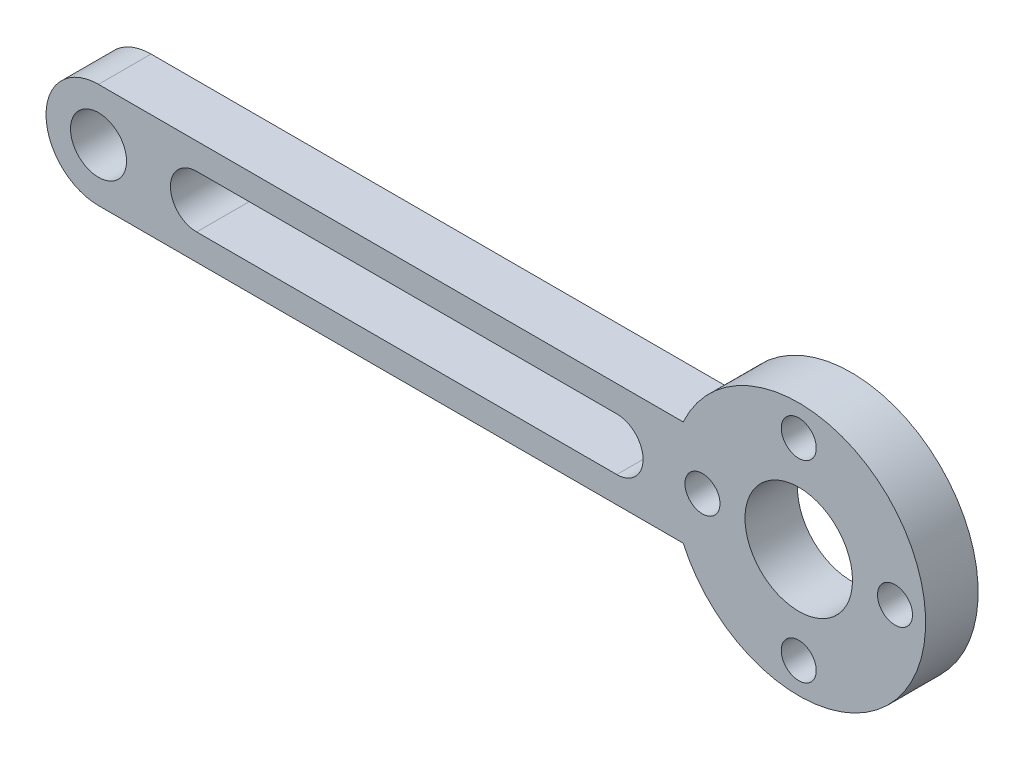
ISO-10303-21;
HEADER;
FILE_DESCRIPTION(('STEP AP214'),'2;1');
FILE_NAME('part.step','',(''),(''),'','','');
FILE_SCHEMA(('AUTOMOTIVE_DESIGN { 1 0 10303 214 1 1 1 1 }'));
ENDSEC;
DATA;
#1=APPLICATION_CONTEXT('core data for automotive mechanical design processes');
#2=APPLICATION_PROTOCOL_DEFINITION('international standard','automotive_design',2000,#1);
#3=PRODUCT_CONTEXT('',#1,'mechanical');
#4=PRODUCT('Part','Part','',(#3));
#5=PRODUCT_RELATED_PRODUCT_CATEGORY('part','',(#4));
#6=PRODUCT_DEFINITION_FORMATION('','',#4);
#7=PRODUCT_DEFINITION_CONTEXT('part definition',#1,'design');
#8=PRODUCT_DEFINITION('design','',#6,#7);
#9=PRODUCT_DEFINITION_SHAPE('','',#8);
#10=(LENGTH_UNIT() NAMED_UNIT(*) SI_UNIT(.MILLI.,.METRE.));
#11=(NAMED_UNIT(*) PLANE_ANGLE_UNIT() SI_UNIT($,.RADIAN.));
#12=(NAMED_UNIT(*) SI_UNIT($,.STERADIAN.) SOLID_ANGLE_UNIT());
#13=UNCERTAINTY_MEASURE_WITH_UNIT(LENGTH_MEASURE(1.E-05),#10,'distance_accuracy_value','');
#14=(GEOMETRIC_REPRESENTATION_CONTEXT(3) GLOBAL_UNCERTAINTY_ASSIGNED_CONTEXT((#13)) GLOBAL_UNIT_ASSIGNED_CONTEXT((#10,
#11,#12)) REPRESENTATION_CONTEXT('',''));
#15=CARTESIAN_POINT('',(0.,0.,0.));
#16=DIRECTION('',(0.,0.,1.));
#17=DIRECTION('',(1.,0.,0.));
#18=AXIS2_PLACEMENT_3D('',#15,#16,#17);
#19=CARTESIAN_POINT('',(0.,-8.,3.));
#20=DIRECTION('',(0.,1.,0.));
#21=DIRECTION('',(0.,0.,1.));
#22=AXIS2_PLACEMENT_3D('',#19,#20,#21);
#23=PLANE('',#22);
#24=DIRECTION('',(1.,0.,0.));
#25=VECTOR('',#24,1.);
#26=CARTESIAN_POINT('',(0.,-8.,0.));
#27=LINE('',#26,#25);
#28=CARTESIAN_POINT('',(12.,-8.,0.));
#29=VERTEX_POINT('',#28);
#30=CARTESIAN_POINT('',(45.399810608778,-8.,0.));
#31=VERTEX_POINT('',#30);
#32=EDGE_CURVE('E161',#29,#31,#27,.T.);
#33=ORIENTED_EDGE('',*,*,#32,.T.);
#34=DIRECTION('',(0.,0.,-1.));
#35=VECTOR('',#34,1.);
#36=CARTESIAN_POINT('',(45.399810608778,-8.,3.));
#37=LINE('',#36,#35);
#38=CARTESIAN_POINT('',(45.399810608778,-8.,3.));
#39=VERTEX_POINT('',#38);
#40=EDGE_CURVE('E11',#39,#31,#37,.T.);
#41=ORIENTED_EDGE('',*,*,#40,.F.);
#42=DIRECTION('',(1.,0.,0.));
#43=VECTOR('',#42,1.);
#44=CARTESIAN_POINT('',(0.,-8.,3.));
#45=LINE('',#44,#43);
#46=CARTESIAN_POINT('',(12.,-8.,3.));
#47=VERTEX_POINT('',#46);
#48=EDGE_CURVE('E114',#47,#39,#45,.T.);
#49=ORIENTED_EDGE('',*,*,#48,.F.);
#50=DIRECTION('',(0.,0.,-1.));
#51=VECTOR('',#50,1.);
#52=CARTESIAN_POINT('',(12.,-8.,3.));
#53=LINE('',#52,#51);
#54=EDGE_CURVE('E169',#47,#29,#53,.T.);
#55=ORIENTED_EDGE('',*,*,#54,.T.);
#56=EDGE_LOOP('',(#33,#41,#49,#55));
#57=FACE_BOUND('',#56,.T.);
#58=ADVANCED_FACE('F37',(#57),#23,.F.);
#59=CARTESIAN_POINT('',(52.,-5.,3.));
#60=DIRECTION('',(0.,0.,-1.));
#61=DIRECTION('',(-1.,0.,0.));
#62=AXIS2_PLACEMENT_3D('',#59,#60,#61);
#63=CYLINDRICAL_SURFACE('',#62,7.25);
#64=CARTESIAN_POINT('',(52.,-5.,0.));
#65=DIRECTION('',(0.,0.,1.));
#66=DIRECTION('',(1.,0.,0.));
#67=AXIS2_PLACEMENT_3D('',#64,#65,#66);
#68=CIRCLE('',#67,7.25);
#69=CARTESIAN_POINT('',(45.399810608778,-2.,0.));
#70=VERTEX_POINT('',#69);
#71=EDGE_CURVE('E120',#31,#70,#68,.T.);
#72=ORIENTED_EDGE('',*,*,#71,.T.);
#73=DIRECTION('',(0.,0.,-1.));
#74=VECTOR('',#73,1.);
#75=CARTESIAN_POINT('',(45.399810608778,-2.,3.));
#76=LINE('',#75,#74);
#77=CARTESIAN_POINT('',(45.399810608778,-2.,3.));
#78=VERTEX_POINT('',#77);
#79=EDGE_CURVE('E47',#78,#70,#76,.T.);
#80=ORIENTED_EDGE('',*,*,#79,.F.);
#81=CARTESIAN_POINT('',(52.,-5.,3.));
#82=DIRECTION('',(0.,0.,1.));
#83=DIRECTION('',(1.,0.,0.));
#84=AXIS2_PLACEMENT_3D('',#81,#82,#83);
#85=CIRCLE('',#84,7.25);
#86=EDGE_CURVE('E108',#39,#78,#85,.T.);
#87=ORIENTED_EDGE('',*,*,#86,.F.);
#88=ORIENTED_EDGE('',*,*,#40,.T.);
#89=EDGE_LOOP('',(#72,#80,#87,#88));
#90=FACE_BOUND('',#89,.T.);
#91=ADVANCED_FACE('F119',(#90),#63,.T.);
#92=CARTESIAN_POINT('',(0.,-2.,3.));
#93=DIRECTION('',(0.,1.,0.));
#94=DIRECTION('',(0.,0.,1.));
#95=AXIS2_PLACEMENT_3D('',#92,#93,#94);
#96=PLANE('',#95);
#97=DIRECTION('',(1.,0.,0.));
#98=VECTOR('',#97,1.);
#99=CARTESIAN_POINT('',(0.,-2.,0.));
#100=LINE('',#99,#98);
#101=CARTESIAN_POINT('',(12.,-2.,0.));
#102=VERTEX_POINT('',#101);
#103=EDGE_CURVE('E165',#102,#70,#100,.T.);
#104=ORIENTED_EDGE('',*,*,#103,.F.);
#105=DIRECTION('',(0.,0.,-1.));
#106=VECTOR('',#105,1.);
#107=CARTESIAN_POINT('',(12.,-2.,3.));
#108=LINE('',#107,#106);
#109=CARTESIAN_POINT('',(12.,-2.,3.));
#110=VERTEX_POINT('',#109);
#111=EDGE_CURVE('E84',#110,#102,#108,.T.);
#112=ORIENTED_EDGE('',*,*,#111,.F.);
#113=DIRECTION('',(1.,0.,0.));
#114=VECTOR('',#113,1.);
#115=CARTESIAN_POINT('',(0.,-2.,3.));
#116=LINE('',#115,#114);
#117=EDGE_CURVE('E112',#110,#78,#116,.T.);
#118=ORIENTED_EDGE('',*,*,#117,.T.);
#119=ORIENTED_EDGE('',*,*,#79,.T.);
#120=EDGE_LOOP('',(#104,#112,#118,#119));
#121=FACE_BOUND('',#120,.T.);
#122=ADVANCED_FACE('F125',(#121),#96,.T.);
#123=CARTESIAN_POINT('',(41.607192877574,-5.,3.));
#124=DIRECTION('',(0.,0.,-1.));
#125=DIRECTION('',(-1.,0.,0.));
#126=AXIS2_PLACEMENT_3D('',#123,#124,#125);
#127=CYLINDRICAL_SURFACE('',#126,1.5);
#128=CARTESIAN_POINT('',(41.607192877574,-5.,0.));
#129=DIRECTION('',(0.,0.,1.));
#130=DIRECTION('',(1.,0.,0.));
#131=AXIS2_PLACEMENT_3D('',#128,#129,#130);
#132=CIRCLE('',#131,1.5);
#133=CARTESIAN_POINT('',(41.607192877574,-6.5,0.));
#134=VERTEX_POINT('',#133);
#135=CARTESIAN_POINT('',(41.607192877574,-3.5,0.));
#136=VERTEX_POINT('',#135);
#137=EDGE_CURVE('E137',#134,#136,#132,.T.);
#138=ORIENTED_EDGE('',*,*,#137,.F.);
#139=DIRECTION('',(0.,0.,-1.));
#140=VECTOR('',#139,1.);
#141=CARTESIAN_POINT('',(41.607192877574,-6.5,3.));
#142=LINE('',#141,#140);
#143=CARTESIAN_POINT('',(41.607192877574,-6.5,3.));
#144=VERTEX_POINT('',#143);
#145=EDGE_CURVE('E41',#144,#134,#142,.T.);
#146=ORIENTED_EDGE('',*,*,#145,.F.);
#147=CARTESIAN_POINT('',(41.607192877574,-5.,3.));
#148=DIRECTION('',(0.,0.,1.));
#149=DIRECTION('',(1.,0.,0.));
#150=AXIS2_PLACEMENT_3D('',#147,#148,#149);
#151=CIRCLE('',#150,1.5);
#152=CARTESIAN_POINT('',(41.607192877574,-3.5,3.));
#153=VERTEX_POINT('',#152);
#154=EDGE_CURVE('E202',#144,#153,#151,.T.);
#155=ORIENTED_EDGE('',*,*,#154,.T.);
#156=DIRECTION('',(0.,0.,-1.));
#157=VECTOR('',#156,1.);
#158=CARTESIAN_POINT('',(41.607192877574,-3.5,3.));
#159=LINE('',#158,#157);
#160=EDGE_CURVE('E127',#153,#136,#159,.T.);
#161=ORIENTED_EDGE('',*,*,#160,.T.);
#162=EDGE_LOOP('',(#138,#146,#155,#161));
#163=FACE_BOUND('',#162,.T.);
#164=ADVANCED_FACE('F184',(#163),#127,.F.);
#165=CARTESIAN_POINT('',(0.,-6.5,3.));
#166=DIRECTION('',(0.,1.,0.));
#167=DIRECTION('',(0.,0.,1.));
#168=AXIS2_PLACEMENT_3D('',#165,#166,#167);
#169=PLANE('',#168);
#170=DIRECTION('',(1.,0.,0.));
#171=VECTOR('',#170,1.);
#172=CARTESIAN_POINT('',(0.,-6.5,0.));
#173=LINE('',#172,#171);
#174=CARTESIAN_POINT('',(17.607192877574,-6.5,0.));
#175=VERTEX_POINT('',#174);
#176=EDGE_CURVE('E140',#175,#134,#173,.T.);
#177=ORIENTED_EDGE('',*,*,#176,.F.);
#178=DIRECTION('',(0.,0.,-1.));
#179=VECTOR('',#178,1.);
#180=CARTESIAN_POINT('',(17.607192877574,-6.5,3.));
#181=LINE('',#180,#179);
#182=CARTESIAN_POINT('',(17.607192877574,-6.5,3.));
#183=VERTEX_POINT('',#182);
#184=EDGE_CURVE('E174',#183,#175,#181,.T.);
#185=ORIENTED_EDGE('',*,*,#184,.F.);
#186=DIRECTION('',(1.,0.,0.));
#187=VECTOR('',#186,1.);
#188=CARTESIAN_POINT('',(0.,-6.5,3.));
#189=LINE('',#188,#187);
#190=EDGE_CURVE('E183',#183,#144,#189,.T.);
#191=ORIENTED_EDGE('',*,*,#190,.T.);
#192=ORIENTED_EDGE('',*,*,#145,.T.);
#193=EDGE_LOOP('',(#177,#185,#191,#192));
#194=FACE_BOUND('',#193,.T.);
#195=ADVANCED_FACE('F181',(#194),#169,.T.);
#196=CARTESIAN_POINT('',(17.607192877574,-5.,3.));
#197=DIRECTION('',(0.,0.,-1.));
#198=DIRECTION('',(-1.,0.,0.));
#199=AXIS2_PLACEMENT_3D('',#196,#197,#198);
#200=CYLINDRICAL_SURFACE('',#199,1.5);
#201=CARTESIAN_POINT('',(17.607192877574,-5.,0.));
#202=DIRECTION('',(0.,0.,1.));
#203=DIRECTION('',(1.,0.,0.));
#204=AXIS2_PLACEMENT_3D('',#201,#202,#203);
#205=CIRCLE('',#204,1.5);
#206=CARTESIAN_POINT('',(17.607192877574,-3.5,0.));
#207=VERTEX_POINT('',#206);
#208=EDGE_CURVE('E143',#207,#175,#205,.T.);
#209=ORIENTED_EDGE('',*,*,#208,.F.);
#210=DIRECTION('',(0.,0.,-1.));
#211=VECTOR('',#210,1.);
#212=CARTESIAN_POINT('',(17.607192877574,-3.5,3.));
#213=LINE('',#212,#211);
#214=CARTESIAN_POINT('',(17.607192877574,-3.5,3.));
#215=VERTEX_POINT('',#214);
#216=EDGE_CURVE('E173',#215,#207,#213,.T.);
#217=ORIENTED_EDGE('',*,*,#216,.F.);
#218=CARTESIAN_POINT('',(17.607192877574,-5.,3.));
#219=DIRECTION('',(0.,0.,1.));
#220=DIRECTION('',(1.,0.,0.));
#221=AXIS2_PLACEMENT_3D('',#218,#219,#220);
#222=CIRCLE('',#221,1.5);
#223=EDGE_CURVE('E193',#215,#183,#222,.T.);
#224=ORIENTED_EDGE('',*,*,#223,.T.);
#225=ORIENTED_EDGE('',*,*,#184,.T.);
#226=EDGE_LOOP('',(#209,#217,#224,#225));
#227=FACE_BOUND('',#226,.T.);
#228=ADVANCED_FACE('F190',(#227),#200,.F.);
#229=CARTESIAN_POINT('',(46.5,-5.,3.));
#230=DIRECTION('',(0.,0.,-1.));
#231=DIRECTION('',(-1.,0.,0.));
#232=AXIS2_PLACEMENT_3D('',#229,#230,#231);
#233=CYLINDRICAL_SURFACE('',#232,0.999999999999998);
#234=CARTESIAN_POINT('',(46.5,-5.,3.));
#235=DIRECTION('',(0.,0.,1.));
#236=DIRECTION('',(1.,0.,0.));
#237=AXIS2_PLACEMENT_3D('',#234,#235,#236);
#238=CIRCLE('',#237,0.999999999999998);
#239=CARTESIAN_POINT('',(47.5,-5.,3.));
#240=VERTEX_POINT('',#239);
#241=EDGE_CURVE('E214',#240,#240,#238,.T.);
#242=ORIENTED_EDGE('',*,*,#241,.T.);
#243=EDGE_LOOP('',(#242));
#244=FACE_BOUND('',#243,.T.);
#245=CARTESIAN_POINT('',(46.5,-5.,0.));
#246=DIRECTION('',(0.,0.,1.));
#247=DIRECTION('',(1.,0.,0.));
#248=AXIS2_PLACEMENT_3D('',#245,#246,#247);
#249=CIRCLE('',#248,0.999999999999998);
#250=CARTESIAN_POINT('',(47.5,-5.,0.));
#251=VERTEX_POINT('',#250);
#252=EDGE_CURVE('E158',#251,#251,#249,.T.);
#253=ORIENTED_EDGE('',*,*,#252,.F.);
#254=EDGE_LOOP('',(#253));
#255=FACE_BOUND('',#254,.T.);
#256=ADVANCED_FACE('F218',(#244,#255),#233,.F.);
#257=CARTESIAN_POINT('',(57.5,-5.,3.));
#258=DIRECTION('',(0.,0.,-1.));
#259=DIRECTION('',(-1.,0.,0.));
#260=AXIS2_PLACEMENT_3D('',#257,#258,#259);
#261=CYLINDRICAL_SURFACE('',#260,0.999999999999998);
#262=CARTESIAN_POINT('',(57.5,-5.,3.));
#263=DIRECTION('',(0.,0.,1.));
#264=DIRECTION('',(1.,0.,0.));
#265=AXIS2_PLACEMENT_3D('',#262,#263,#264);
#266=CIRCLE('',#265,0.999999999999998);
#267=CARTESIAN_POINT('',(58.5,-5.,3.));
#268=VERTEX_POINT('',#267);
#269=EDGE_CURVE('E211',#268,#268,#266,.T.);
#270=ORIENTED_EDGE('',*,*,#269,.T.);
#271=EDGE_LOOP('',(#270));
#272=FACE_BOUND('',#271,.T.);
#273=CARTESIAN_POINT('',(57.5,-5.,0.));
#274=DIRECTION('',(0.,0.,1.));
#275=DIRECTION('',(1.,0.,0.));
#276=AXIS2_PLACEMENT_3D('',#273,#274,#275);
#277=CIRCLE('',#276,0.999999999999998);
#278=CARTESIAN_POINT('',(58.5,-5.,0.));
#279=VERTEX_POINT('',#278);
#280=EDGE_CURVE('E155',#279,#279,#277,.T.);
#281=ORIENTED_EDGE('',*,*,#280,.F.);
#282=EDGE_LOOP('',(#281));
#283=FACE_BOUND('',#282,.T.);
#284=ADVANCED_FACE('F245',(#272,#283),#261,.F.);
#285=CARTESIAN_POINT('',(52.,-5.,3.));
#286=DIRECTION('',(0.,0.,-1.));
#287=DIRECTION('',(-1.,0.,0.));
#288=AXIS2_PLACEMENT_3D('',#285,#286,#287);
#289=CYLINDRICAL_SURFACE('',#288,3.07121734914909);
#290=CARTESIAN_POINT('',(52.,-5.,3.));
#291=DIRECTION('',(0.,0.,1.));
#292=DIRECTION('',(1.,0.,0.));
#293=AXIS2_PLACEMENT_3D('',#290,#291,#292);
#294=CIRCLE('',#293,3.07121734914909);
#295=CARTESIAN_POINT('',(55.0712173491491,-5.,3.));
#296=VERTEX_POINT('',#295);
#297=EDGE_CURVE('E208',#296,#296,#294,.T.);
#298=ORIENTED_EDGE('',*,*,#297,.T.);
#299=EDGE_LOOP('',(#298));
#300=FACE_BOUND('',#299,.T.);
#301=CARTESIAN_POINT('',(52.,-5.,0.));
#302=DIRECTION('',(0.,0.,1.));
#303=DIRECTION('',(1.,0.,0.));
#304=AXIS2_PLACEMENT_3D('',#301,#302,#303);
#305=CIRCLE('',#304,3.07121734914909);
#306=CARTESIAN_POINT('',(55.0712173491491,-5.,0.));
#307=VERTEX_POINT('',#306);
#308=EDGE_CURVE('E152',#307,#307,#305,.T.);
#309=ORIENTED_EDGE('',*,*,#308,.F.);
#310=EDGE_LOOP('',(#309));
#311=FACE_BOUND('',#310,.T.);
#312=ADVANCED_FACE('F248',(#300,#311),#289,.F.);
#313=CARTESIAN_POINT('',(12.,-5.,3.));
#314=DIRECTION('',(0.,0.,-1.));
#315=DIRECTION('',(-1.,0.,0.));
#316=AXIS2_PLACEMENT_3D('',#313,#314,#315);
#317=CYLINDRICAL_SURFACE('',#316,1.6);
#318=CARTESIAN_POINT('',(12.,-5.,3.));
#319=DIRECTION('',(0.,0.,1.));
#320=DIRECTION('',(1.,0.,0.));
#321=AXIS2_PLACEMENT_3D('',#318,#319,#320);
#322=CIRCLE('',#321,1.6);
#323=CARTESIAN_POINT('',(13.6,-5.,3.));
#324=VERTEX_POINT('',#323);
#325=EDGE_CURVE('E198',#324,#324,#322,.T.);
#326=ORIENTED_EDGE('',*,*,#325,.T.);
#327=EDGE_LOOP('',(#326));
#328=FACE_BOUND('',#327,.T.);
#329=CARTESIAN_POINT('',(12.,-5.,0.));
#330=DIRECTION('',(0.,0.,1.));
#331=DIRECTION('',(1.,0.,0.));
#332=AXIS2_PLACEMENT_3D('',#329,#330,#331);
#333=CIRCLE('',#332,1.6);
#334=CARTESIAN_POINT('',(13.6,-5.,0.));
#335=VERTEX_POINT('',#334);
#336=EDGE_CURVE('E149',#335,#335,#333,.T.);
#337=ORIENTED_EDGE('',*,*,#336,.F.);
#338=EDGE_LOOP('',(#337));
#339=FACE_BOUND('',#338,.T.);
#340=ADVANCED_FACE('F252',(#328,#339),#317,.F.);
#341=CARTESIAN_POINT('',(0.,-3.5,3.));
#342=DIRECTION('',(0.,1.,0.));
#343=DIRECTION('',(0.,0.,1.));
#344=AXIS2_PLACEMENT_3D('',#341,#342,#343);
#345=PLANE('',#344);
#346=DIRECTION('',(1.,0.,0.));
#347=VECTOR('',#346,1.);
#348=CARTESIAN_POINT('',(0.,-3.5,0.));
#349=LINE('',#348,#347);
#350=EDGE_CURVE('E146',#207,#136,#349,.T.);
#351=ORIENTED_EDGE('',*,*,#350,.T.);
#352=ORIENTED_EDGE('',*,*,#160,.F.);
#353=DIRECTION('',(1.,0.,0.));
#354=VECTOR('',#353,1.);
#355=CARTESIAN_POINT('',(0.,-3.5,3.));
#356=LINE('',#355,#354);
#357=EDGE_CURVE('E195',#215,#153,#356,.T.);
#358=ORIENTED_EDGE('',*,*,#357,.F.);
#359=ORIENTED_EDGE('',*,*,#216,.T.);
#360=EDGE_LOOP('',(#351,#352,#358,#359));
#361=FACE_BOUND('',#360,.T.);
#362=ADVANCED_FACE('F196',(#361),#345,.F.);
#363=CARTESIAN_POINT('',(52.,-10.5,3.));
#364=DIRECTION('',(0.,0.,-1.));
#365=DIRECTION('',(-1.,0.,0.));
#366=AXIS2_PLACEMENT_3D('',#363,#364,#365);
#367=CYLINDRICAL_SURFACE('',#366,1.);
#368=CARTESIAN_POINT('',(52.,-10.5,3.));
#369=DIRECTION('',(0.,0.,1.));
#370=DIRECTION('',(1.,0.,0.));
#371=AXIS2_PLACEMENT_3D('',#368,#369,#370);
#372=CIRCLE('',#371,1.);
#373=CARTESIAN_POINT('',(53.,-10.5,3.));
#374=VERTEX_POINT('',#373);
#375=EDGE_CURVE('E274',#374,#374,#372,.T.);
#376=ORIENTED_EDGE('',*,*,#375,.T.);
#377=EDGE_LOOP('',(#376));
#378=FACE_BOUND('',#377,.T.);
#379=CARTESIAN_POINT('',(52.,-10.5,0.));
#380=DIRECTION('',(0.,0.,1.));
#381=DIRECTION('',(1.,0.,0.));
#382=AXIS2_PLACEMENT_3D('',#379,#380,#381);
#383=CIRCLE('',#382,1.);
#384=CARTESIAN_POINT('',(53.,-10.5,0.));
#385=VERTEX_POINT('',#384);
#386=EDGE_CURVE('E134',#385,#385,#383,.T.);
#387=ORIENTED_EDGE('',*,*,#386,.F.);
#388=EDGE_LOOP('',(#387));
#389=FACE_BOUND('',#388,.T.);
#390=ADVANCED_FACE('F259',(#378,#389),#367,.F.);
#391=CARTESIAN_POINT('',(52.,0.499999999999994,3.));
#392=DIRECTION('',(0.,0.,-1.));
#393=DIRECTION('',(-1.,0.,0.));
#394=AXIS2_PLACEMENT_3D('',#391,#392,#393);
#395=CYLINDRICAL_SURFACE('',#394,1.);
#396=CARTESIAN_POINT('',(52.,0.499999999999994,3.));
#397=DIRECTION('',(0.,0.,1.));
#398=DIRECTION('',(1.,0.,0.));
#399=AXIS2_PLACEMENT_3D('',#396,#397,#398);
#400=CIRCLE('',#399,1.);
#401=CARTESIAN_POINT('',(53.,0.499999999999994,3.));
#402=VERTEX_POINT('',#401);
#403=EDGE_CURVE('E168',#402,#402,#400,.T.);
#404=ORIENTED_EDGE('',*,*,#403,.T.);
#405=EDGE_LOOP('',(#404));
#406=FACE_BOUND('',#405,.T.);
#407=CARTESIAN_POINT('',(52.,0.499999999999994,0.));
#408=DIRECTION('',(0.,0.,1.));
#409=DIRECTION('',(1.,0.,0.));
#410=AXIS2_PLACEMENT_3D('',#407,#408,#409);
#411=CIRCLE('',#410,1.);
#412=CARTESIAN_POINT('',(53.,0.499999999999994,0.));
#413=VERTEX_POINT('',#412);
#414=EDGE_CURVE('E131',#413,#413,#411,.T.);
#415=ORIENTED_EDGE('',*,*,#414,.F.);
#416=EDGE_LOOP('',(#415));
#417=FACE_BOUND('',#416,.T.);
#418=ADVANCED_FACE('F39',(#406,#417),#395,.F.);
#419=CARTESIAN_POINT('',(12.,-5.,3.));
#420=DIRECTION('',(0.,0.,-1.));
#421=DIRECTION('',(-1.,0.,0.));
#422=AXIS2_PLACEMENT_3D('',#419,#420,#421);
#423=CYLINDRICAL_SURFACE('',#422,3.);
#424=CARTESIAN_POINT('',(12.,-5.,0.));
#425=DIRECTION('',(0.,0.,1.));
#426=DIRECTION('',(1.,0.,0.));
#427=AXIS2_PLACEMENT_3D('',#424,#425,#426);
#428=CIRCLE('',#427,3.);
#429=EDGE_CURVE('E87',#102,#29,#428,.T.);
#430=ORIENTED_EDGE('',*,*,#429,.T.);
#431=ORIENTED_EDGE('',*,*,#54,.F.);
#432=CARTESIAN_POINT('',(12.,-5.,3.));
#433=DIRECTION('',(0.,0.,1.));
#434=DIRECTION('',(1.,0.,0.));
#435=AXIS2_PLACEMENT_3D('',#432,#433,#434);
#436=CIRCLE('',#435,3.);
#437=EDGE_CURVE('E56',#110,#47,#436,.T.);
#438=ORIENTED_EDGE('',*,*,#437,.F.);
#439=ORIENTED_EDGE('',*,*,#111,.T.);
#440=EDGE_LOOP('',(#430,#431,#438,#439));
#441=FACE_BOUND('',#440,.T.);
#442=ADVANCED_FACE('F222',(#441),#423,.T.);
#443=CARTESIAN_POINT('',(0.,0.,3.));
#444=DIRECTION('',(0.,0.,1.));
#445=DIRECTION('',(1.,0.,0.));
#446=AXIS2_PLACEMENT_3D('',#443,#444,#445);
#447=PLANE('',#446);
#448=ORIENTED_EDGE('',*,*,#403,.F.);
#449=EDGE_LOOP('',(#448));
#450=FACE_BOUND('',#449,.T.);
#451=ORIENTED_EDGE('',*,*,#375,.F.);
#452=EDGE_LOOP('',(#451));
#453=FACE_BOUND('',#452,.T.);
#454=ORIENTED_EDGE('',*,*,#154,.F.);
#455=ORIENTED_EDGE('',*,*,#190,.F.);
#456=ORIENTED_EDGE('',*,*,#223,.F.);
#457=ORIENTED_EDGE('',*,*,#357,.T.);
#458=EDGE_LOOP('',(#454,#455,#456,#457));
#459=FACE_BOUND('',#458,.T.);
#460=ORIENTED_EDGE('',*,*,#325,.F.);
#461=EDGE_LOOP('',(#460));
#462=FACE_BOUND('',#461,.T.);
#463=ORIENTED_EDGE('',*,*,#297,.F.);
#464=EDGE_LOOP('',(#463));
#465=FACE_BOUND('',#464,.T.);
#466=ORIENTED_EDGE('',*,*,#269,.F.);
#467=EDGE_LOOP('',(#466));
#468=FACE_BOUND('',#467,.T.);
#469=ORIENTED_EDGE('',*,*,#241,.F.);
#470=EDGE_LOOP('',(#469));
#471=FACE_BOUND('',#470,.T.);
#472=ORIENTED_EDGE('',*,*,#48,.T.);
#473=ORIENTED_EDGE('',*,*,#86,.T.);
#474=ORIENTED_EDGE('',*,*,#117,.F.);
#475=ORIENTED_EDGE('',*,*,#437,.T.);
#476=EDGE_LOOP('',(#472,#473,#474,#475));
#477=FACE_BOUND('',#476,.T.);
#478=ADVANCED_FACE('F110',(#450,#453,#459,#462,#465,#468,#471,#477),#447,.T.);
#479=CARTESIAN_POINT('',(0.,0.,0.));
#480=DIRECTION('',(0.,0.,1.));
#481=DIRECTION('',(1.,0.,0.));
#482=AXIS2_PLACEMENT_3D('',#479,#480,#481);
#483=PLANE('',#482);
#484=ORIENTED_EDGE('',*,*,#414,.T.);
#485=EDGE_LOOP('',(#484));
#486=FACE_BOUND('',#485,.T.);
#487=ORIENTED_EDGE('',*,*,#386,.T.);
#488=EDGE_LOOP('',(#487));
#489=FACE_BOUND('',#488,.T.);
#490=ORIENTED_EDGE('',*,*,#137,.T.);
#491=ORIENTED_EDGE('',*,*,#350,.F.);
#492=ORIENTED_EDGE('',*,*,#208,.T.);
#493=ORIENTED_EDGE('',*,*,#176,.T.);
#494=EDGE_LOOP('',(#490,#491,#492,#493));
#495=FACE_BOUND('',#494,.T.);
#496=ORIENTED_EDGE('',*,*,#336,.T.);
#497=EDGE_LOOP('',(#496));
#498=FACE_BOUND('',#497,.T.);
#499=ORIENTED_EDGE('',*,*,#308,.T.);
#500=EDGE_LOOP('',(#499));
#501=FACE_BOUND('',#500,.T.);
#502=ORIENTED_EDGE('',*,*,#280,.T.);
#503=EDGE_LOOP('',(#502));
#504=FACE_BOUND('',#503,.T.);
#505=ORIENTED_EDGE('',*,*,#252,.T.);
#506=EDGE_LOOP('',(#505));
#507=FACE_BOUND('',#506,.T.);
#508=ORIENTED_EDGE('',*,*,#32,.F.);
#509=ORIENTED_EDGE('',*,*,#429,.F.);
#510=ORIENTED_EDGE('',*,*,#103,.T.);
#511=ORIENTED_EDGE('',*,*,#71,.F.);
#512=EDGE_LOOP('',(#508,#509,#510,#511));
#513=FACE_BOUND('',#512,.T.);
#514=ADVANCED_FACE('F188',(#486,#489,#495,#498,#501,#504,#507,#513),#483,.F.);
#515=CLOSED_SHELL('',(#58,#91,#122,#164,#195,#228,#256,#284,#312,#340,#362,#390,#418,#442,#478,#514));
#516=MANIFOLD_SOLID_BREP('B2',#515);
#517=ADVANCED_BREP_SHAPE_REPRESENTATION('',(#18,#516),#14);
#518=SHAPE_DEFINITION_REPRESENTATION(#9,#517);
ENDSEC;
END-ISO-10303-21;
